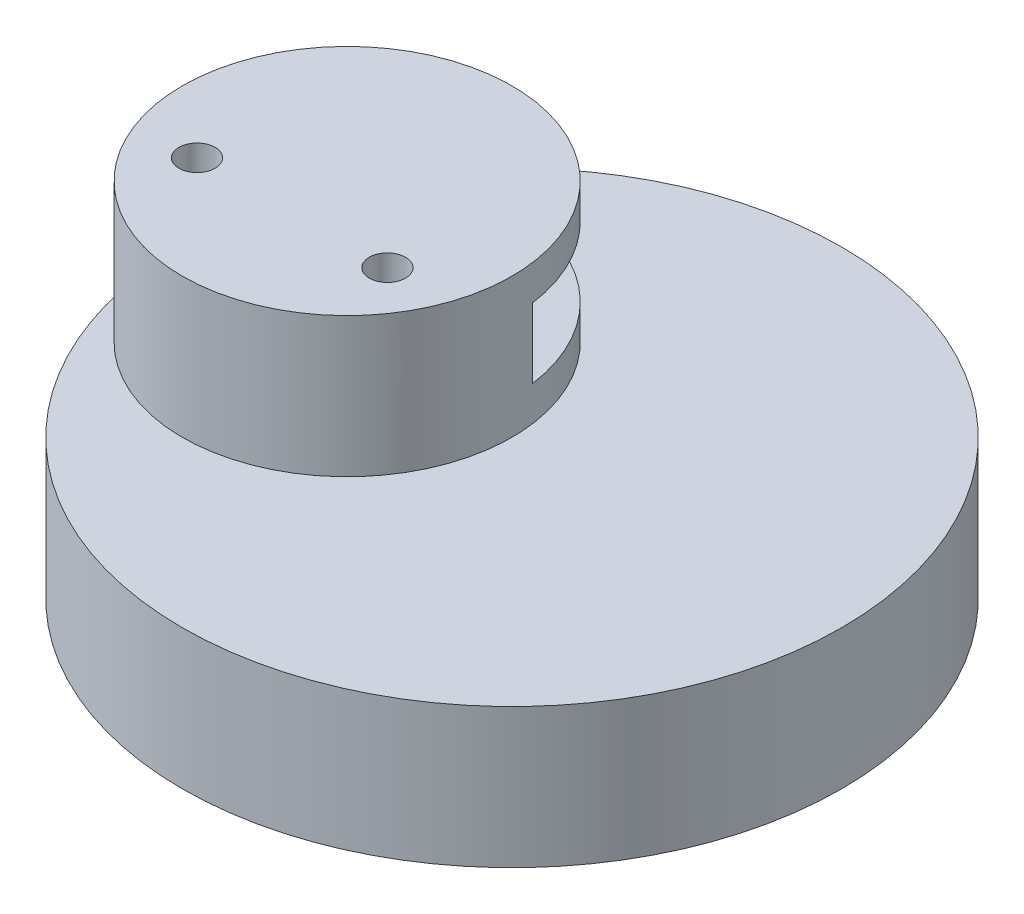
ISO-10303-21;
HEADER;
FILE_DESCRIPTION(('STEP AP214'),'2;1');
FILE_NAME('part.step','',(''),(''),'','','');
FILE_SCHEMA(('AUTOMOTIVE_DESIGN { 1 0 10303 214 1 1 1 1 }'));
ENDSEC;
DATA;
#1=APPLICATION_CONTEXT('core data for automotive mechanical design processes');
#2=APPLICATION_PROTOCOL_DEFINITION('international standard','automotive_design',2000,#1);
#3=PRODUCT_CONTEXT('',#1,'mechanical');
#4=PRODUCT('Part','Part','',(#3));
#5=PRODUCT_RELATED_PRODUCT_CATEGORY('part','',(#4));
#6=PRODUCT_DEFINITION_FORMATION('','',#4);
#7=PRODUCT_DEFINITION_CONTEXT('part definition',#1,'design');
#8=PRODUCT_DEFINITION('design','',#6,#7);
#9=PRODUCT_DEFINITION_SHAPE('','',#8);
#10=(LENGTH_UNIT() NAMED_UNIT(*) SI_UNIT(.MILLI.,.METRE.));
#11=(NAMED_UNIT(*) PLANE_ANGLE_UNIT() SI_UNIT($,.RADIAN.));
#12=(NAMED_UNIT(*) SI_UNIT($,.STERADIAN.) SOLID_ANGLE_UNIT());
#13=UNCERTAINTY_MEASURE_WITH_UNIT(LENGTH_MEASURE(1.E-05),#10,'distance_accuracy_value','');
#14=(GEOMETRIC_REPRESENTATION_CONTEXT(3) GLOBAL_UNCERTAINTY_ASSIGNED_CONTEXT((#13)) GLOBAL_UNIT_ASSIGNED_CONTEXT((#10,
#11,#12)) REPRESENTATION_CONTEXT('',''));
#15=CARTESIAN_POINT('',(0.,0.,0.));
#16=DIRECTION('',(0.,0.,1.));
#17=DIRECTION('',(1.,0.,0.));
#18=AXIS2_PLACEMENT_3D('',#15,#16,#17);
#19=CARTESIAN_POINT('',(0.,12.7,0.));
#20=DIRECTION('',(0.,-1.,0.));
#21=DIRECTION('',(0.,0.,-1.));
#22=AXIS2_PLACEMENT_3D('',#19,#20,#21);
#23=CYLINDRICAL_SURFACE('',#22,15.);
#24=CARTESIAN_POINT('',(0.,3.175,0.));
#25=DIRECTION('',(0.,-1.,0.));
#26=DIRECTION('',(0.,0.,-1.));
#27=AXIS2_PLACEMENT_3D('',#24,#25,#26);
#28=CIRCLE('',#27,15.);
#29=CARTESIAN_POINT('',(-14.8660687473185,3.175,-2.));
#30=VERTEX_POINT('',#29);
#31=CARTESIAN_POINT('',(14.8660687473185,3.175,-2.));
#32=VERTEX_POINT('',#31);
#33=EDGE_CURVE('E11',#30,#32,#28,.T.);
#34=ORIENTED_EDGE('',*,*,#33,.T.);
#35=DIRECTION('',(0.,-1.,0.));
#36=VECTOR('',#35,1.);
#37=CARTESIAN_POINT('',(14.8660687473185,12.7,-2.));
#38=LINE('',#37,#36);
#39=CARTESIAN_POINT('',(14.8660687473185,9.525,-2.));
#40=VERTEX_POINT('',#39);
#41=EDGE_CURVE('E172',#32,#40,#38,.F.);
#42=ORIENTED_EDGE('',*,*,#41,.T.);
#43=CARTESIAN_POINT('',(0.,9.525,0.));
#44=DIRECTION('',(0.,1.,0.));
#45=DIRECTION('',(0.,0.,1.));
#46=AXIS2_PLACEMENT_3D('',#43,#44,#45);
#47=CIRCLE('',#46,15.);
#48=CARTESIAN_POINT('',(-14.8660687473185,9.525,-2.));
#49=VERTEX_POINT('',#48);
#50=EDGE_CURVE('E165',#40,#49,#47,.T.);
#51=ORIENTED_EDGE('',*,*,#50,.T.);
#52=DIRECTION('',(0.,-1.,0.));
#53=VECTOR('',#52,1.);
#54=CARTESIAN_POINT('',(-14.8660687473185,12.7,-2.));
#55=LINE('',#54,#53);
#56=EDGE_CURVE('E53',#49,#30,#55,.T.);
#57=ORIENTED_EDGE('',*,*,#56,.T.);
#58=EDGE_LOOP('',(#34,#42,#51,#57));
#59=FACE_BOUND('',#58,.T.);
#60=CARTESIAN_POINT('',(0.,12.7,0.));
#61=DIRECTION('',(0.,1.,0.));
#62=DIRECTION('',(0.,0.,1.));
#63=AXIS2_PLACEMENT_3D('',#60,#61,#62);
#64=CIRCLE('',#63,15.);
#65=CARTESIAN_POINT('',(0.,12.7,15.));
#66=VERTEX_POINT('',#65);
#67=EDGE_CURVE('E161',#66,#66,#64,.T.);
#68=ORIENTED_EDGE('',*,*,#67,.F.);
#69=EDGE_LOOP('',(#68));
#70=FACE_BOUND('',#69,.T.);
#71=CARTESIAN_POINT('',(0.,0.,0.));
#72=DIRECTION('',(0.,1.,0.));
#73=DIRECTION('',(0.,0.,1.));
#74=AXIS2_PLACEMENT_3D('',#71,#72,#73);
#75=CIRCLE('',#74,15.);
#76=CARTESIAN_POINT('',(-15.,0.,0.));
#77=VERTEX_POINT('',#76);
#78=EDGE_CURVE('E158',#77,#77,#75,.T.);
#79=ORIENTED_EDGE('',*,*,#78,.T.);
#80=EDGE_LOOP('',(#79));
#81=FACE_BOUND('',#80,.T.);
#82=ADVANCED_FACE('F45',(#59,#70,#81),#23,.T.);
#83=CARTESIAN_POINT('',(0.,12.7,0.));
#84=DIRECTION('',(0.,1.,0.));
#85=DIRECTION('',(0.,0.,1.));
#86=AXIS2_PLACEMENT_3D('',#83,#84,#85);
#87=PLANE('',#86);
#88=CARTESIAN_POINT('',(-8.6602540378444,12.7,4.99999999999998));
#89=DIRECTION('',(0.,1.,0.));
#90=DIRECTION('',(0.,0.,1.));
#91=AXIS2_PLACEMENT_3D('',#88,#89,#90);
#92=CIRCLE('',#91,1.64999999999999);
#93=CARTESIAN_POINT('',(-8.6602540378444,12.7,6.64999999999997));
#94=VERTEX_POINT('',#93);
#95=EDGE_CURVE('E132',#94,#94,#92,.T.);
#96=ORIENTED_EDGE('',*,*,#95,.F.);
#97=EDGE_LOOP('',(#96));
#98=FACE_BOUND('',#97,.T.);
#99=CARTESIAN_POINT('',(8.66025403784436,12.7,5.00000000000004));
#100=DIRECTION('',(0.,1.,0.));
#101=DIRECTION('',(0.,0.,1.));
#102=AXIS2_PLACEMENT_3D('',#99,#100,#101);
#103=CIRCLE('',#102,1.64999999999999);
#104=CARTESIAN_POINT('',(8.66025403784436,12.7,6.65000000000003));
#105=VERTEX_POINT('',#104);
#106=EDGE_CURVE('E140',#105,#105,#103,.T.);
#107=ORIENTED_EDGE('',*,*,#106,.F.);
#108=EDGE_LOOP('',(#107));
#109=FACE_BOUND('',#108,.T.);
#110=ORIENTED_EDGE('',*,*,#67,.T.);
#111=EDGE_LOOP('',(#110));
#112=FACE_BOUND('',#111,.T.);
#113=ADVANCED_FACE('F198',(#98,#109,#112),#87,.T.);
#114=CARTESIAN_POINT('',(15.,-12.7,0.));
#115=DIRECTION('',(0.,1.,0.));
#116=DIRECTION('',(0.,0.,1.));
#117=AXIS2_PLACEMENT_3D('',#114,#115,#116);
#118=CYLINDRICAL_SURFACE('',#117,30.);
#119=CARTESIAN_POINT('',(15.,-12.7,0.));
#120=DIRECTION('',(0.,1.,0.));
#121=DIRECTION('',(0.,0.,1.));
#122=AXIS2_PLACEMENT_3D('',#119,#120,#121);
#123=CIRCLE('',#122,30.);
#124=CARTESIAN_POINT('',(15.,-12.7,30.));
#125=VERTEX_POINT('',#124);
#126=EDGE_CURVE('E154',#125,#125,#123,.T.);
#127=ORIENTED_EDGE('',*,*,#126,.T.);
#128=EDGE_LOOP('',(#127));
#129=FACE_BOUND('',#128,.T.);
#130=CARTESIAN_POINT('',(15.,0.,0.));
#131=DIRECTION('',(0.,1.,0.));
#132=DIRECTION('',(0.,0.,1.));
#133=AXIS2_PLACEMENT_3D('',#130,#131,#132);
#134=CIRCLE('',#133,30.);
#135=EDGE_CURVE('E70',#77,#77,#134,.T.);
#136=ORIENTED_EDGE('',*,*,#135,.F.);
#137=EDGE_LOOP('',(#136));
#138=FACE_BOUND('',#137,.T.);
#139=ADVANCED_FACE('F202',(#129,#138),#118,.T.);
#140=CARTESIAN_POINT('',(0.,-12.7,0.));
#141=DIRECTION('',(0.,1.,0.));
#142=DIRECTION('',(0.,0.,1.));
#143=AXIS2_PLACEMENT_3D('',#140,#141,#142);
#144=PLANE('',#143);
#145=CARTESIAN_POINT('',(15.,-12.7,-20.));
#146=DIRECTION('',(0.,-1.,0.));
#147=DIRECTION('',(0.,0.,-1.));
#148=AXIS2_PLACEMENT_3D('',#145,#146,#147);
#149=CIRCLE('',#148,1.64999999999999);
#150=CARTESIAN_POINT('',(15.,-12.7,-21.65));
#151=VERTEX_POINT('',#150);
#152=EDGE_CURVE('E110',#151,#151,#149,.T.);
#153=ORIENTED_EDGE('',*,*,#152,.F.);
#154=EDGE_LOOP('',(#153));
#155=FACE_BOUND('',#154,.T.);
#156=CARTESIAN_POINT('',(32.3205080756888,-12.7,9.99999999999997));
#157=DIRECTION('',(0.,-1.,0.));
#158=DIRECTION('',(0.,0.,-1.));
#159=AXIS2_PLACEMENT_3D('',#156,#157,#158);
#160=CIRCLE('',#159,1.64999999999999);
#161=CARTESIAN_POINT('',(32.3205080756888,-12.7,8.34999999999997));
#162=VERTEX_POINT('',#161);
#163=EDGE_CURVE('E109',#162,#162,#160,.T.);
#164=ORIENTED_EDGE('',*,*,#163,.F.);
#165=EDGE_LOOP('',(#164));
#166=FACE_BOUND('',#165,.T.);
#167=CARTESIAN_POINT('',(-2.32050807568873,-12.7,10.0000000000001));
#168=DIRECTION('',(0.,-1.,0.));
#169=DIRECTION('',(0.,0.,-1.));
#170=AXIS2_PLACEMENT_3D('',#167,#168,#169);
#171=CIRCLE('',#170,1.64999999999999);
#172=CARTESIAN_POINT('',(-2.32050807568873,-12.7,8.35000000000009));
#173=VERTEX_POINT('',#172);
#174=EDGE_CURVE('E124',#173,#173,#171,.T.);
#175=ORIENTED_EDGE('',*,*,#174,.F.);
#176=EDGE_LOOP('',(#175));
#177=FACE_BOUND('',#176,.T.);
#178=ORIENTED_EDGE('',*,*,#126,.F.);
#179=EDGE_LOOP('',(#178));
#180=FACE_BOUND('',#179,.T.);
#181=ADVANCED_FACE('F193',(#155,#166,#177,#180),#144,.F.);
#182=CARTESIAN_POINT('',(0.,0.,0.));
#183=DIRECTION('',(0.,1.,0.));
#184=DIRECTION('',(0.,0.,1.));
#185=AXIS2_PLACEMENT_3D('',#182,#183,#184);
#186=PLANE('',#185);
#187=ORIENTED_EDGE('',*,*,#135,.T.);
#188=ORIENTED_EDGE('',*,*,#78,.F.);
#189=EDGE_LOOP('',(#187,#188));
#190=FACE_BOUND('',#189,.T.);
#191=ADVANCED_FACE('F185',(#190),#186,.T.);
#192=CARTESIAN_POINT('',(-15.,3.175,-15.));
#193=DIRECTION('',(0.,-1.,0.));
#194=DIRECTION('',(0.,0.,-1.));
#195=AXIS2_PLACEMENT_3D('',#192,#193,#194);
#196=PLANE('',#195);
#197=ORIENTED_EDGE('',*,*,#33,.F.);
#198=DIRECTION('',(1.,0.,0.));
#199=VECTOR('',#198,1.);
#200=CARTESIAN_POINT('',(-15.,3.175,-2.));
#201=LINE('',#200,#199);
#202=EDGE_CURVE('E148',#30,#32,#201,.T.);
#203=ORIENTED_EDGE('',*,*,#202,.T.);
#204=EDGE_LOOP('',(#197,#203));
#205=FACE_BOUND('',#204,.T.);
#206=ADVANCED_FACE('F183',(#205),#196,.F.);
#207=CARTESIAN_POINT('',(-15.,9.525,-2.));
#208=DIRECTION('',(0.,0.,1.));
#209=DIRECTION('',(1.,0.,0.));
#210=AXIS2_PLACEMENT_3D('',#207,#208,#209);
#211=PLANE('',#210);
#212=DIRECTION('',(1.,0.,0.));
#213=VECTOR('',#212,1.);
#214=CARTESIAN_POINT('',(-15.,9.525,-2.));
#215=LINE('',#214,#213);
#216=EDGE_CURVE('E62',#49,#40,#215,.T.);
#217=ORIENTED_EDGE('',*,*,#216,.T.);
#218=ORIENTED_EDGE('',*,*,#41,.F.);
#219=ORIENTED_EDGE('',*,*,#202,.F.);
#220=ORIENTED_EDGE('',*,*,#56,.F.);
#221=EDGE_LOOP('',(#217,#218,#219,#220));
#222=FACE_BOUND('',#221,.T.);
#223=ADVANCED_FACE('F181',(#222),#211,.F.);
#224=CARTESIAN_POINT('',(-15.,9.525,-15.));
#225=DIRECTION('',(0.,1.,0.));
#226=DIRECTION('',(0.,0.,1.));
#227=AXIS2_PLACEMENT_3D('',#224,#225,#226);
#228=PLANE('',#227);
#229=ORIENTED_EDGE('',*,*,#216,.F.);
#230=ORIENTED_EDGE('',*,*,#50,.F.);
#231=EDGE_LOOP('',(#229,#230));
#232=FACE_BOUND('',#231,.T.);
#233=ADVANCED_FACE('F191',(#232),#228,.F.);
#234=CARTESIAN_POINT('',(8.66025403784436,2.6,5.00000000000004));
#235=DIRECTION('',(0.,1.,0.));
#236=DIRECTION('',(0.,0.,1.));
#237=AXIS2_PLACEMENT_3D('',#234,#235,#236);
#238=CONICAL_SURFACE('',#237,1.64999999999999,1.02974425867665);
#239=CARTESIAN_POINT('',(8.66025403784436,1.60857997860452,5.00000000000004));
#240=VERTEX_POINT('',#239);
#241=VERTEX_LOOP('',#240);
#242=FACE_BOUND('',#241,.T.);
#243=CARTESIAN_POINT('',(8.66025403784436,2.6,5.00000000000004));
#244=DIRECTION('',(0.,1.,0.));
#245=DIRECTION('',(0.,0.,1.));
#246=AXIS2_PLACEMENT_3D('',#243,#244,#245);
#247=CIRCLE('',#246,1.64999999999999);
#248=CARTESIAN_POINT('',(8.66025403784436,2.6,6.65000000000003));
#249=VERTEX_POINT('',#248);
#250=EDGE_CURVE('E144',#249,#249,#247,.T.);
#251=ORIENTED_EDGE('',*,*,#250,.T.);
#252=EDGE_LOOP('',(#251));
#253=FACE_BOUND('',#252,.T.);
#254=ADVANCED_FACE('F216',(#242,#253),#238,.F.);
#255=CARTESIAN_POINT('',(8.66025403784436,12.7,5.00000000000004));
#256=DIRECTION('',(0.,1.,0.));
#257=DIRECTION('',(0.,0.,1.));
#258=AXIS2_PLACEMENT_3D('',#255,#256,#257);
#259=CYLINDRICAL_SURFACE('',#258,1.64999999999999);
#260=ORIENTED_EDGE('',*,*,#250,.F.);
#261=EDGE_LOOP('',(#260));
#262=FACE_BOUND('',#261,.T.);
#263=ORIENTED_EDGE('',*,*,#106,.T.);
#264=EDGE_LOOP('',(#263));
#265=FACE_BOUND('',#264,.T.);
#266=ADVANCED_FACE('F220',(#262,#265),#259,.F.);
#267=CARTESIAN_POINT('',(-8.6602540378444,2.6,4.99999999999998));
#268=DIRECTION('',(0.,1.,0.));
#269=DIRECTION('',(0.,0.,1.));
#270=AXIS2_PLACEMENT_3D('',#267,#268,#269);
#271=CONICAL_SURFACE('',#270,1.64999999999999,1.02974425867665);
#272=CARTESIAN_POINT('',(-8.6602540378444,1.60857997860452,4.99999999999998));
#273=VERTEX_POINT('',#272);
#274=VERTEX_LOOP('',#273);
#275=FACE_BOUND('',#274,.T.);
#276=CARTESIAN_POINT('',(-8.6602540378444,2.6,4.99999999999998));
#277=DIRECTION('',(0.,1.,0.));
#278=DIRECTION('',(0.,0.,1.));
#279=AXIS2_PLACEMENT_3D('',#276,#277,#278);
#280=CIRCLE('',#279,1.64999999999999);
#281=CARTESIAN_POINT('',(-8.6602540378444,2.6,6.64999999999997));
#282=VERTEX_POINT('',#281);
#283=EDGE_CURVE('E136',#282,#282,#280,.T.);
#284=ORIENTED_EDGE('',*,*,#283,.T.);
#285=EDGE_LOOP('',(#284));
#286=FACE_BOUND('',#285,.T.);
#287=ADVANCED_FACE('F225',(#275,#286),#271,.F.);
#288=CARTESIAN_POINT('',(-8.6602540378444,12.7,4.99999999999998));
#289=DIRECTION('',(0.,1.,0.));
#290=DIRECTION('',(0.,0.,1.));
#291=AXIS2_PLACEMENT_3D('',#288,#289,#290);
#292=CYLINDRICAL_SURFACE('',#291,1.64999999999999);
#293=ORIENTED_EDGE('',*,*,#283,.F.);
#294=EDGE_LOOP('',(#293));
#295=FACE_BOUND('',#294,.T.);
#296=ORIENTED_EDGE('',*,*,#95,.T.);
#297=EDGE_LOOP('',(#296));
#298=FACE_BOUND('',#297,.T.);
#299=ADVANCED_FACE('F232',(#295,#298),#292,.F.);
#300=CARTESIAN_POINT('',(-2.32050807568873,-2.6,10.0000000000001));
#301=DIRECTION('',(0.,-1.,0.));
#302=DIRECTION('',(0.,0.,-1.));
#303=AXIS2_PLACEMENT_3D('',#300,#301,#302);
#304=CONICAL_SURFACE('',#303,1.64999999999999,1.02974425867665);
#305=CARTESIAN_POINT('',(-2.32050807568873,-1.60857997860452,10.0000000000001));
#306=VERTEX_POINT('',#305);
#307=VERTEX_LOOP('',#306);
#308=FACE_BOUND('',#307,.T.);
#309=CARTESIAN_POINT('',(-2.32050807568873,-2.6,10.0000000000001));
#310=DIRECTION('',(0.,-1.,0.));
#311=DIRECTION('',(0.,0.,-1.));
#312=AXIS2_PLACEMENT_3D('',#309,#310,#311);
#313=CIRCLE('',#312,1.64999999999999);
#314=CARTESIAN_POINT('',(-2.32050807568873,-2.6,8.35000000000009));
#315=VERTEX_POINT('',#314);
#316=EDGE_CURVE('E128',#315,#315,#313,.T.);
#317=ORIENTED_EDGE('',*,*,#316,.T.);
#318=EDGE_LOOP('',(#317));
#319=FACE_BOUND('',#318,.T.);
#320=ADVANCED_FACE('F236',(#308,#319),#304,.F.);
#321=CARTESIAN_POINT('',(-2.32050807568873,-12.7,10.0000000000001));
#322=DIRECTION('',(0.,-1.,0.));
#323=DIRECTION('',(0.,0.,-1.));
#324=AXIS2_PLACEMENT_3D('',#321,#322,#323);
#325=CYLINDRICAL_SURFACE('',#324,1.64999999999999);
#326=ORIENTED_EDGE('',*,*,#316,.F.);
#327=EDGE_LOOP('',(#326));
#328=FACE_BOUND('',#327,.T.);
#329=ORIENTED_EDGE('',*,*,#174,.T.);
#330=EDGE_LOOP('',(#329));
#331=FACE_BOUND('',#330,.T.);
#332=ADVANCED_FACE('F240',(#328,#331),#325,.F.);
#333=CARTESIAN_POINT('',(32.3205080756888,-2.6,9.99999999999997));
#334=DIRECTION('',(0.,-1.,0.));
#335=DIRECTION('',(0.,0.,-1.));
#336=AXIS2_PLACEMENT_3D('',#333,#334,#335);
#337=CONICAL_SURFACE('',#336,1.64999999999999,1.02974425867665);
#338=CARTESIAN_POINT('',(32.3205080756888,-1.60857997860452,9.99999999999997));
#339=VERTEX_POINT('',#338);
#340=VERTEX_LOOP('',#339);
#341=FACE_BOUND('',#340,.T.);
#342=CARTESIAN_POINT('',(32.3205080756888,-2.6,9.99999999999997));
#343=DIRECTION('',(0.,-1.,0.));
#344=DIRECTION('',(0.,0.,-1.));
#345=AXIS2_PLACEMENT_3D('',#342,#343,#344);
#346=CIRCLE('',#345,1.64999999999999);
#347=CARTESIAN_POINT('',(32.3205080756888,-2.6,8.34999999999997));
#348=VERTEX_POINT('',#347);
#349=EDGE_CURVE('E115',#348,#348,#346,.T.);
#350=ORIENTED_EDGE('',*,*,#349,.T.);
#351=EDGE_LOOP('',(#350));
#352=FACE_BOUND('',#351,.T.);
#353=ADVANCED_FACE('F244',(#341,#352),#337,.F.);
#354=CARTESIAN_POINT('',(32.3205080756888,-12.7,9.99999999999997));
#355=DIRECTION('',(0.,-1.,0.));
#356=DIRECTION('',(0.,0.,-1.));
#357=AXIS2_PLACEMENT_3D('',#354,#355,#356);
#358=CYLINDRICAL_SURFACE('',#357,1.64999999999999);
#359=ORIENTED_EDGE('',*,*,#349,.F.);
#360=EDGE_LOOP('',(#359));
#361=FACE_BOUND('',#360,.T.);
#362=ORIENTED_EDGE('',*,*,#163,.T.);
#363=EDGE_LOOP('',(#362));
#364=FACE_BOUND('',#363,.T.);
#365=ADVANCED_FACE('F102',(#361,#364),#358,.F.);
#366=CARTESIAN_POINT('',(15.,-2.6,-20.));
#367=DIRECTION('',(0.,-1.,0.));
#368=DIRECTION('',(0.,0.,-1.));
#369=AXIS2_PLACEMENT_3D('',#366,#367,#368);
#370=CONICAL_SURFACE('',#369,1.64999999999999,1.02974425867665);
#371=CARTESIAN_POINT('',(15.,-1.60857997860452,-20.));
#372=VERTEX_POINT('',#371);
#373=VERTEX_LOOP('',#372);
#374=FACE_BOUND('',#373,.T.);
#375=CARTESIAN_POINT('',(15.,-2.6,-20.));
#376=DIRECTION('',(0.,-1.,0.));
#377=DIRECTION('',(0.,0.,-1.));
#378=AXIS2_PLACEMENT_3D('',#375,#376,#377);
#379=CIRCLE('',#378,1.64999999999999);
#380=CARTESIAN_POINT('',(15.,-2.6,-21.65));
#381=VERTEX_POINT('',#380);
#382=EDGE_CURVE('E106',#381,#381,#379,.T.);
#383=ORIENTED_EDGE('',*,*,#382,.T.);
#384=EDGE_LOOP('',(#383));
#385=FACE_BOUND('',#384,.T.);
#386=ADVANCED_FACE('F98',(#374,#385),#370,.F.);
#387=CARTESIAN_POINT('',(15.,-12.7,-20.));
#388=DIRECTION('',(0.,-1.,0.));
#389=DIRECTION('',(0.,0.,-1.));
#390=AXIS2_PLACEMENT_3D('',#387,#388,#389);
#391=CYLINDRICAL_SURFACE('',#390,1.64999999999999);
#392=ORIENTED_EDGE('',*,*,#382,.F.);
#393=EDGE_LOOP('',(#392));
#394=FACE_BOUND('',#393,.T.);
#395=ORIENTED_EDGE('',*,*,#152,.T.);
#396=EDGE_LOOP('',(#395));
#397=FACE_BOUND('',#396,.T.);
#398=ADVANCED_FACE('F101',(#394,#397),#391,.F.);
#399=CLOSED_SHELL('',(#82,#113,#139,#181,#191,#206,#223,#233,#254,#266,#287,#299,#320,#332,#353,
#365,#386,#398));
#400=MANIFOLD_SOLID_BREP('B2',#399);
#401=ADVANCED_BREP_SHAPE_REPRESENTATION('',(#18,#400),#14);
#402=SHAPE_DEFINITION_REPRESENTATION(#9,#401);
ENDSEC;
END-ISO-10303-21;
